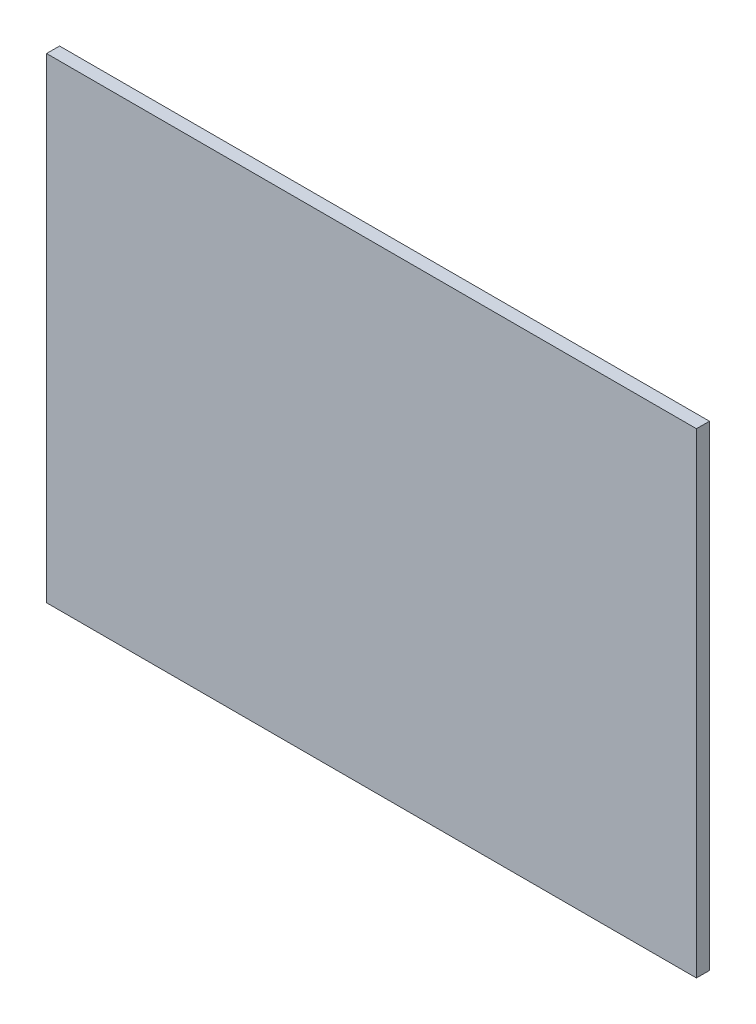
ISO-10303-21;
HEADER;
FILE_DESCRIPTION(('STEP AP214'),'2;1');
FILE_NAME('part.step','',(''),(''),'','','');
FILE_SCHEMA(('AUTOMOTIVE_DESIGN { 1 0 10303 214 1 1 1 1 }'));
ENDSEC;
DATA;
#1=APPLICATION_CONTEXT('core data for automotive mechanical design processes');
#2=APPLICATION_PROTOCOL_DEFINITION('international standard','automotive_design',2000,#1);
#3=PRODUCT_CONTEXT('',#1,'mechanical');
#4=PRODUCT('Part','Part','',(#3));
#5=PRODUCT_RELATED_PRODUCT_CATEGORY('part','',(#4));
#6=PRODUCT_DEFINITION_FORMATION('','',#4);
#7=PRODUCT_DEFINITION_CONTEXT('part definition',#1,'design');
#8=PRODUCT_DEFINITION('design','',#6,#7);
#9=PRODUCT_DEFINITION_SHAPE('','',#8);
#10=(LENGTH_UNIT() NAMED_UNIT(*) SI_UNIT(.MILLI.,.METRE.));
#11=(NAMED_UNIT(*) PLANE_ANGLE_UNIT() SI_UNIT($,.RADIAN.));
#12=(NAMED_UNIT(*) SI_UNIT($,.STERADIAN.) SOLID_ANGLE_UNIT());
#13=UNCERTAINTY_MEASURE_WITH_UNIT(LENGTH_MEASURE(1.E-05),#10,'distance_accuracy_value','');
#14=(GEOMETRIC_REPRESENTATION_CONTEXT(3) GLOBAL_UNCERTAINTY_ASSIGNED_CONTEXT((#13)) GLOBAL_UNIT_ASSIGNED_CONTEXT((#10,
#11,#12)) REPRESENTATION_CONTEXT('',''));
#15=CARTESIAN_POINT('',(0.,0.,0.));
#16=DIRECTION('',(0.,0.,1.));
#17=DIRECTION('',(1.,0.,0.));
#18=AXIS2_PLACEMENT_3D('',#15,#16,#17);
#19=CARTESIAN_POINT('',(2500.,1829.999999993,100.));
#20=DIRECTION('',(1.,0.,0.));
#21=DIRECTION('',(0.,1.,0.));
#22=AXIS2_PLACEMENT_3D('',#19,#20,#21);
#23=PLANE('',#22);
#24=DIRECTION('',(0.,-1.,0.));
#25=VECTOR('',#24,1.);
#26=CARTESIAN_POINT('',(2500.,1829.999999993,0.));
#27=LINE('',#26,#25);
#28=CARTESIAN_POINT('',(2500.,1829.999999993,0.));
#29=VERTEX_POINT('',#28);
#30=CARTESIAN_POINT('',(2500.,-1829.999999993,0.));
#31=VERTEX_POINT('',#30);
#32=EDGE_CURVE('E102',#29,#31,#27,.T.);
#33=ORIENTED_EDGE('',*,*,#32,.F.);
#34=DIRECTION('',(0.,0.,-1.));
#35=VECTOR('',#34,1.);
#36=CARTESIAN_POINT('',(2500.,1829.999999993,100.));
#37=LINE('',#36,#35);
#38=CARTESIAN_POINT('',(2500.,1829.999999993,100.));
#39=VERTEX_POINT('',#38);
#40=EDGE_CURVE('E11',#39,#29,#37,.T.);
#41=ORIENTED_EDGE('',*,*,#40,.F.);
#42=DIRECTION('',(0.,-1.,0.));
#43=VECTOR('',#42,1.);
#44=CARTESIAN_POINT('',(2500.,1829.999999993,100.));
#45=LINE('',#44,#43);
#46=CARTESIAN_POINT('',(2500.,-1829.999999993,100.));
#47=VERTEX_POINT('',#46);
#48=EDGE_CURVE('E97',#39,#47,#45,.T.);
#49=ORIENTED_EDGE('',*,*,#48,.T.);
#50=DIRECTION('',(0.,0.,-1.));
#51=VECTOR('',#50,1.);
#52=CARTESIAN_POINT('',(2500.,-1829.999999993,100.));
#53=LINE('',#52,#51);
#54=EDGE_CURVE('E40',#47,#31,#53,.T.);
#55=ORIENTED_EDGE('',*,*,#54,.T.);
#56=EDGE_LOOP('',(#33,#41,#49,#55));
#57=FACE_BOUND('',#56,.T.);
#58=ADVANCED_FACE('F37',(#57),#23,.T.);
#59=CARTESIAN_POINT('',(2500.,1829.999999993,100.));
#60=DIRECTION('',(0.,-1.,0.));
#61=DIRECTION('',(1.,0.,0.));
#62=AXIS2_PLACEMENT_3D('',#59,#60,#61);
#63=PLANE('',#62);
#64=DIRECTION('',(-1.,0.,0.));
#65=VECTOR('',#64,1.);
#66=CARTESIAN_POINT('',(2500.,1829.999999993,0.));
#67=LINE('',#66,#65);
#68=CARTESIAN_POINT('',(-2500.,1829.999999993,0.));
#69=VERTEX_POINT('',#68);
#70=EDGE_CURVE('E70',#29,#69,#67,.T.);
#71=ORIENTED_EDGE('',*,*,#70,.T.);
#72=DIRECTION('',(0.,0.,-1.));
#73=VECTOR('',#72,1.);
#74=CARTESIAN_POINT('',(-2500.,1829.999999993,100.));
#75=LINE('',#74,#73);
#76=CARTESIAN_POINT('',(-2500.,1829.999999993,100.));
#77=VERTEX_POINT('',#76);
#78=EDGE_CURVE('E46',#77,#69,#75,.T.);
#79=ORIENTED_EDGE('',*,*,#78,.F.);
#80=DIRECTION('',(-1.,0.,0.));
#81=VECTOR('',#80,1.);
#82=CARTESIAN_POINT('',(2500.,1829.999999993,100.));
#83=LINE('',#82,#81);
#84=EDGE_CURVE('E87',#39,#77,#83,.T.);
#85=ORIENTED_EDGE('',*,*,#84,.F.);
#86=ORIENTED_EDGE('',*,*,#40,.T.);
#87=EDGE_LOOP('',(#71,#79,#85,#86));
#88=FACE_BOUND('',#87,.T.);
#89=ADVANCED_FACE('F112',(#88),#63,.F.);
#90=CARTESIAN_POINT('',(-2500.,1829.999999993,100.));
#91=DIRECTION('',(1.,0.,0.));
#92=DIRECTION('',(0.,1.,0.));
#93=AXIS2_PLACEMENT_3D('',#90,#91,#92);
#94=PLANE('',#93);
#95=DIRECTION('',(0.,-1.,0.));
#96=VECTOR('',#95,1.);
#97=CARTESIAN_POINT('',(-2500.,1829.999999993,0.));
#98=LINE('',#97,#96);
#99=CARTESIAN_POINT('',(-2500.,-1829.999999993,0.));
#100=VERTEX_POINT('',#99);
#101=EDGE_CURVE('E94',#69,#100,#98,.T.);
#102=ORIENTED_EDGE('',*,*,#101,.T.);
#103=DIRECTION('',(0.,0.,-1.));
#104=VECTOR('',#103,1.);
#105=CARTESIAN_POINT('',(-2500.,-1829.999999993,100.));
#106=LINE('',#105,#104);
#107=CARTESIAN_POINT('',(-2500.,-1829.999999993,100.));
#108=VERTEX_POINT('',#107);
#109=EDGE_CURVE('E91',#108,#100,#106,.T.);
#110=ORIENTED_EDGE('',*,*,#109,.F.);
#111=DIRECTION('',(0.,-1.,0.));
#112=VECTOR('',#111,1.);
#113=CARTESIAN_POINT('',(-2500.,1829.999999993,100.));
#114=LINE('',#113,#112);
#115=EDGE_CURVE('E82',#77,#108,#114,.T.);
#116=ORIENTED_EDGE('',*,*,#115,.F.);
#117=ORIENTED_EDGE('',*,*,#78,.T.);
#118=EDGE_LOOP('',(#102,#110,#116,#117));
#119=FACE_BOUND('',#118,.T.);
#120=ADVANCED_FACE('F92',(#119),#94,.F.);
#121=CARTESIAN_POINT('',(2500.,-1829.999999993,100.));
#122=DIRECTION('',(0.,-1.,0.));
#123=DIRECTION('',(1.,0.,0.));
#124=AXIS2_PLACEMENT_3D('',#121,#122,#123);
#125=PLANE('',#124);
#126=DIRECTION('',(-1.,0.,0.));
#127=VECTOR('',#126,1.);
#128=CARTESIAN_POINT('',(2500.,-1829.999999993,0.));
#129=LINE('',#128,#127);
#130=EDGE_CURVE('E105',#31,#100,#129,.T.);
#131=ORIENTED_EDGE('',*,*,#130,.F.);
#132=ORIENTED_EDGE('',*,*,#54,.F.);
#133=DIRECTION('',(-1.,0.,0.));
#134=VECTOR('',#133,1.);
#135=CARTESIAN_POINT('',(2500.,-1829.999999993,100.));
#136=LINE('',#135,#134);
#137=EDGE_CURVE('E86',#47,#108,#136,.T.);
#138=ORIENTED_EDGE('',*,*,#137,.T.);
#139=ORIENTED_EDGE('',*,*,#109,.T.);
#140=EDGE_LOOP('',(#131,#132,#138,#139));
#141=FACE_BOUND('',#140,.T.);
#142=ADVANCED_FACE('F96',(#141),#125,.T.);
#143=CARTESIAN_POINT('',(0.,0.,100.));
#144=DIRECTION('',(0.,0.,-1.));
#145=DIRECTION('',(-1.,0.,0.));
#146=AXIS2_PLACEMENT_3D('',#143,#144,#145);
#147=PLANE('',#146);
#148=ORIENTED_EDGE('',*,*,#48,.F.);
#149=ORIENTED_EDGE('',*,*,#84,.T.);
#150=ORIENTED_EDGE('',*,*,#115,.T.);
#151=ORIENTED_EDGE('',*,*,#137,.F.);
#152=EDGE_LOOP('',(#148,#149,#150,#151));
#153=FACE_BOUND('',#152,.T.);
#154=ADVANCED_FACE('F85',(#153),#147,.F.);
#155=CARTESIAN_POINT('',(0.,0.,0.));
#156=DIRECTION('',(0.,0.,-1.));
#157=DIRECTION('',(-1.,0.,0.));
#158=AXIS2_PLACEMENT_3D('',#155,#156,#157);
#159=PLANE('',#158);
#160=ORIENTED_EDGE('',*,*,#32,.T.);
#161=ORIENTED_EDGE('',*,*,#130,.T.);
#162=ORIENTED_EDGE('',*,*,#101,.F.);
#163=ORIENTED_EDGE('',*,*,#70,.F.);
#164=EDGE_LOOP('',(#160,#161,#162,#163));
#165=FACE_BOUND('',#164,.T.);
#166=ADVANCED_FACE('F110',(#165),#159,.T.);
#167=CLOSED_SHELL('',(#58,#89,#120,#142,#154,#166));
#168=MANIFOLD_SOLID_BREP('B2',#167);
#169=ADVANCED_BREP_SHAPE_REPRESENTATION('',(#18,#168),#14);
#170=SHAPE_DEFINITION_REPRESENTATION(#9,#169);
ENDSEC;
END-ISO-10303-21;
